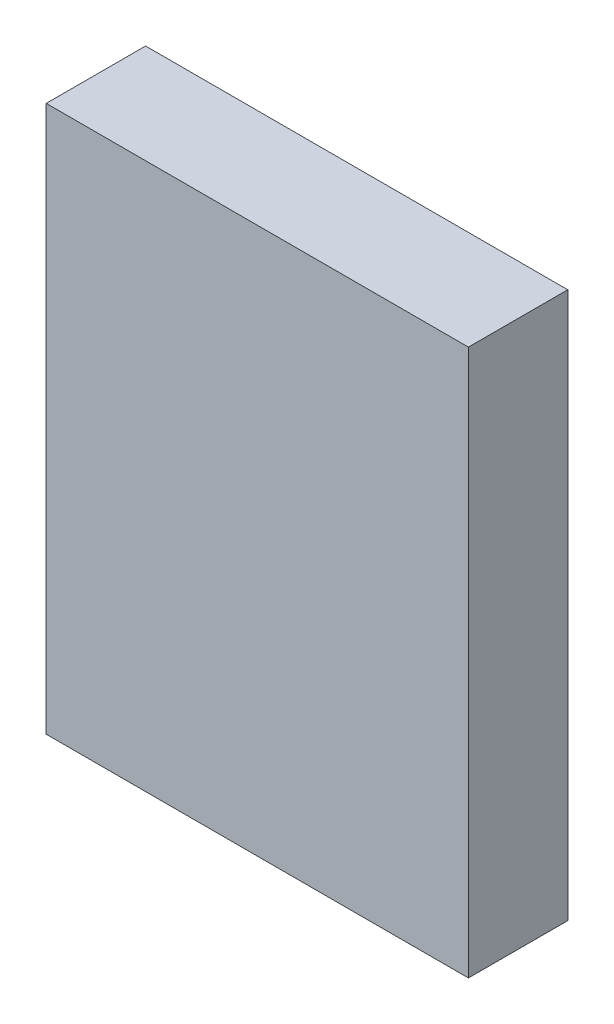
ISO-10303-21;
HEADER;
FILE_DESCRIPTION(('STEP AP214'),'2;1');
FILE_NAME('part.step','',(''),(''),'','','');
FILE_SCHEMA(('AUTOMOTIVE_DESIGN { 1 0 10303 214 1 1 1 1 }'));
ENDSEC;
DATA;
#1=APPLICATION_CONTEXT('core data for automotive mechanical design processes');
#2=APPLICATION_PROTOCOL_DEFINITION('international standard','automotive_design',2000,#1);
#3=PRODUCT_CONTEXT('',#1,'mechanical');
#4=PRODUCT('Part','Part','',(#3));
#5=PRODUCT_RELATED_PRODUCT_CATEGORY('part','',(#4));
#6=PRODUCT_DEFINITION_FORMATION('','',#4);
#7=PRODUCT_DEFINITION_CONTEXT('part definition',#1,'design');
#8=PRODUCT_DEFINITION('design','',#6,#7);
#9=PRODUCT_DEFINITION_SHAPE('','',#8);
#10=(LENGTH_UNIT() NAMED_UNIT(*) SI_UNIT(.MILLI.,.METRE.));
#11=(NAMED_UNIT(*) PLANE_ANGLE_UNIT() SI_UNIT($,.RADIAN.));
#12=(NAMED_UNIT(*) SI_UNIT($,.STERADIAN.) SOLID_ANGLE_UNIT());
#13=UNCERTAINTY_MEASURE_WITH_UNIT(LENGTH_MEASURE(1.E-05),#10,'distance_accuracy_value','');
#14=(GEOMETRIC_REPRESENTATION_CONTEXT(3) GLOBAL_UNCERTAINTY_ASSIGNED_CONTEXT((#13)) GLOBAL_UNIT_ASSIGNED_CONTEXT((#10,
#11,#12)) REPRESENTATION_CONTEXT('',''));
#15=CARTESIAN_POINT('',(0.,0.,0.));
#16=DIRECTION('',(0.,0.,1.));
#17=DIRECTION('',(1.,0.,0.));
#18=AXIS2_PLACEMENT_3D('',#15,#16,#17);
#19=CARTESIAN_POINT('',(3.5,0.55,0.));
#20=DIRECTION('',(0.,1.,0.));
#21=DIRECTION('',(-1.,0.,0.));
#22=AXIS2_PLACEMENT_3D('',#19,#20,#21);
#23=PLANE('',#22);
#24=DIRECTION('',(-1.,0.,0.));
#25=VECTOR('',#24,1.);
#26=CARTESIAN_POINT('',(3.5,0.55,0.));
#27=LINE('',#26,#25);
#28=CARTESIAN_POINT('',(3.5,0.55,0.));
#29=VERTEX_POINT('',#28);
#30=CARTESIAN_POINT('',(2.65,0.55,0.));
#31=VERTEX_POINT('',#30);
#32=EDGE_CURVE('E11',#29,#31,#27,.T.);
#33=ORIENTED_EDGE('',*,*,#32,.T.);
#34=DIRECTION('',(0.,0.,1.));
#35=VECTOR('',#34,1.);
#36=CARTESIAN_POINT('',(2.65,0.55,0.));
#37=LINE('',#36,#35);
#38=CARTESIAN_POINT('',(2.65,0.55,0.2));
#39=VERTEX_POINT('',#38);
#40=EDGE_CURVE('E24',#31,#39,#37,.T.);
#41=ORIENTED_EDGE('',*,*,#40,.T.);
#42=DIRECTION('',(-1.,0.,0.));
#43=VECTOR('',#42,1.);
#44=CARTESIAN_POINT('',(3.5,0.55,0.2));
#45=LINE('',#44,#43);
#46=CARTESIAN_POINT('',(3.5,0.55,0.2));
#47=VERTEX_POINT('',#46);
#48=EDGE_CURVE('E88',#47,#39,#45,.T.);
#49=ORIENTED_EDGE('',*,*,#48,.F.);
#50=DIRECTION('',(0.,0.,1.));
#51=VECTOR('',#50,1.);
#52=CARTESIAN_POINT('',(3.5,0.55,0.));
#53=LINE('',#52,#51);
#54=EDGE_CURVE('E71',#29,#47,#53,.T.);
#55=ORIENTED_EDGE('',*,*,#54,.F.);
#56=EDGE_LOOP('',(#33,#41,#49,#55));
#57=FACE_BOUND('',#56,.T.);
#58=ADVANCED_FACE('F17',(#57),#23,.T.);
#59=CARTESIAN_POINT('',(0.,0.,0.));
#60=DIRECTION('',(0.,0.,1.));
#61=DIRECTION('',(1.,0.,0.));
#62=AXIS2_PLACEMENT_3D('',#59,#60,#61);
#63=PLANE('',#62);
#64=DIRECTION('',(0.,1.,0.));
#65=VECTOR('',#64,1.);
#66=CARTESIAN_POINT('',(3.5,-0.55,0.));
#67=LINE('',#66,#65);
#68=CARTESIAN_POINT('',(3.5,-0.55,0.));
#69=VERTEX_POINT('',#68);
#70=EDGE_CURVE('E85',#69,#29,#67,.T.);
#71=ORIENTED_EDGE('',*,*,#70,.F.);
#72=DIRECTION('',(1.,0.,0.));
#73=VECTOR('',#72,1.);
#74=CARTESIAN_POINT('',(2.65,-0.55,0.));
#75=LINE('',#74,#73);
#76=CARTESIAN_POINT('',(2.65,-0.55,0.));
#77=VERTEX_POINT('',#76);
#78=EDGE_CURVE('E75',#77,#69,#75,.T.);
#79=ORIENTED_EDGE('',*,*,#78,.F.);
#80=DIRECTION('',(0.,-1.,0.));
#81=VECTOR('',#80,1.);
#82=CARTESIAN_POINT('',(2.65,0.55,0.));
#83=LINE('',#82,#81);
#84=EDGE_CURVE('E81',#31,#77,#83,.T.);
#85=ORIENTED_EDGE('',*,*,#84,.F.);
#86=ORIENTED_EDGE('',*,*,#32,.F.);
#87=EDGE_LOOP('',(#71,#79,#85,#86));
#88=FACE_BOUND('',#87,.T.);
#89=ADVANCED_FACE('F91',(#88),#63,.F.);
#90=CARTESIAN_POINT('',(2.65,0.55,0.));
#91=DIRECTION('',(-1.,0.,0.));
#92=DIRECTION('',(0.,-1.,0.));
#93=AXIS2_PLACEMENT_3D('',#90,#91,#92);
#94=PLANE('',#93);
#95=ORIENTED_EDGE('',*,*,#84,.T.);
#96=DIRECTION('',(0.,0.,1.));
#97=VECTOR('',#96,1.);
#98=CARTESIAN_POINT('',(2.65,-0.55,0.));
#99=LINE('',#98,#97);
#100=CARTESIAN_POINT('',(2.65,-0.55,0.2));
#101=VERTEX_POINT('',#100);
#102=EDGE_CURVE('E79',#77,#101,#99,.T.);
#103=ORIENTED_EDGE('',*,*,#102,.T.);
#104=DIRECTION('',(0.,-1.,0.));
#105=VECTOR('',#104,1.);
#106=CARTESIAN_POINT('',(2.65,0.55,0.2));
#107=LINE('',#106,#105);
#108=EDGE_CURVE('E60',#39,#101,#107,.T.);
#109=ORIENTED_EDGE('',*,*,#108,.F.);
#110=ORIENTED_EDGE('',*,*,#40,.F.);
#111=EDGE_LOOP('',(#95,#103,#109,#110));
#112=FACE_BOUND('',#111,.T.);
#113=ADVANCED_FACE('F90',(#112),#94,.T.);
#114=CARTESIAN_POINT('',(0.,0.,0.2));
#115=DIRECTION('',(0.,0.,1.));
#116=DIRECTION('',(1.,0.,0.));
#117=AXIS2_PLACEMENT_3D('',#114,#115,#116);
#118=PLANE('',#117);
#119=ORIENTED_EDGE('',*,*,#48,.T.);
#120=ORIENTED_EDGE('',*,*,#108,.T.);
#121=DIRECTION('',(1.,0.,0.));
#122=VECTOR('',#121,1.);
#123=CARTESIAN_POINT('',(2.65,-0.55,0.2));
#124=LINE('',#123,#122);
#125=CARTESIAN_POINT('',(3.5,-0.55,0.2));
#126=VERTEX_POINT('',#125);
#127=EDGE_CURVE('E54',#101,#126,#124,.T.);
#128=ORIENTED_EDGE('',*,*,#127,.T.);
#129=DIRECTION('',(0.,1.,0.));
#130=VECTOR('',#129,1.);
#131=CARTESIAN_POINT('',(3.5,-0.55,0.2));
#132=LINE('',#131,#130);
#133=EDGE_CURVE('E58',#126,#47,#132,.T.);
#134=ORIENTED_EDGE('',*,*,#133,.T.);
#135=EDGE_LOOP('',(#119,#120,#128,#134));
#136=FACE_BOUND('',#135,.T.);
#137=ADVANCED_FACE('F57',(#136),#118,.T.);
#138=CARTESIAN_POINT('',(3.5,-0.55,0.));
#139=DIRECTION('',(1.,0.,0.));
#140=DIRECTION('',(0.,1.,0.));
#141=AXIS2_PLACEMENT_3D('',#138,#139,#140);
#142=PLANE('',#141);
#143=ORIENTED_EDGE('',*,*,#70,.T.);
#144=ORIENTED_EDGE('',*,*,#54,.T.);
#145=ORIENTED_EDGE('',*,*,#133,.F.);
#146=DIRECTION('',(0.,0.,1.));
#147=VECTOR('',#146,1.);
#148=CARTESIAN_POINT('',(3.5,-0.55,0.));
#149=LINE('',#148,#147);
#150=EDGE_CURVE('E70',#69,#126,#149,.T.);
#151=ORIENTED_EDGE('',*,*,#150,.F.);
#152=EDGE_LOOP('',(#143,#144,#145,#151));
#153=FACE_BOUND('',#152,.T.);
#154=ADVANCED_FACE('F69',(#153),#142,.T.);
#155=CARTESIAN_POINT('',(2.65,-0.55,0.));
#156=DIRECTION('',(0.,-1.,0.));
#157=DIRECTION('',(1.,0.,0.));
#158=AXIS2_PLACEMENT_3D('',#155,#156,#157);
#159=PLANE('',#158);
#160=ORIENTED_EDGE('',*,*,#78,.T.);
#161=ORIENTED_EDGE('',*,*,#150,.T.);
#162=ORIENTED_EDGE('',*,*,#127,.F.);
#163=ORIENTED_EDGE('',*,*,#102,.F.);
#164=EDGE_LOOP('',(#160,#161,#162,#163));
#165=FACE_BOUND('',#164,.T.);
#166=ADVANCED_FACE('F74',(#165),#159,.T.);
#167=CLOSED_SHELL('',(#58,#89,#113,#137,#154,#166));
#168=MANIFOLD_SOLID_BREP('B1',#167);
#169=ADVANCED_BREP_SHAPE_REPRESENTATION('',(#18,#168),#14);
#170=SHAPE_DEFINITION_REPRESENTATION(#9,#169);
ENDSEC;
END-ISO-10303-21;
